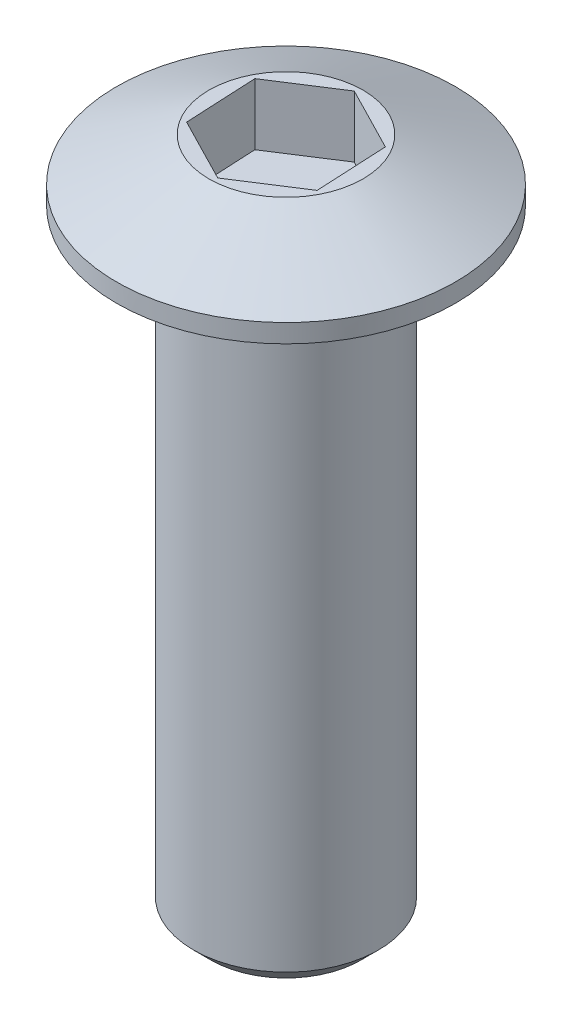
ISO-10303-21;
HEADER;
FILE_DESCRIPTION(('STEP AP214'),'2;1');
FILE_NAME('part.step','',(''),(''),'','','');
FILE_SCHEMA(('AUTOMOTIVE_DESIGN { 1 0 10303 214 1 1 1 1 }'));
ENDSEC;
DATA;
#1=APPLICATION_CONTEXT('core data for automotive mechanical design processes');
#2=APPLICATION_PROTOCOL_DEFINITION('international standard','automotive_design',2000,#1);
#3=PRODUCT_CONTEXT('',#1,'mechanical');
#4=PRODUCT('Part','Part','',(#3));
#5=PRODUCT_RELATED_PRODUCT_CATEGORY('part','',(#4));
#6=PRODUCT_DEFINITION_FORMATION('','',#4);
#7=PRODUCT_DEFINITION_CONTEXT('part definition',#1,'design');
#8=PRODUCT_DEFINITION('design','',#6,#7);
#9=PRODUCT_DEFINITION_SHAPE('','',#8);
#10=(LENGTH_UNIT() NAMED_UNIT(*) SI_UNIT(.MILLI.,.METRE.));
#11=(NAMED_UNIT(*) PLANE_ANGLE_UNIT() SI_UNIT($,.RADIAN.));
#12=(NAMED_UNIT(*) SI_UNIT($,.STERADIAN.) SOLID_ANGLE_UNIT());
#13=UNCERTAINTY_MEASURE_WITH_UNIT(LENGTH_MEASURE(1.E-05),#10,'distance_accuracy_value','');
#14=(GEOMETRIC_REPRESENTATION_CONTEXT(3) GLOBAL_UNCERTAINTY_ASSIGNED_CONTEXT((#13)) GLOBAL_UNIT_ASSIGNED_CONTEXT((#10,
#11,#12)) REPRESENTATION_CONTEXT('',''));
#15=CARTESIAN_POINT('',(0.,0.,0.));
#16=DIRECTION('',(0.,0.,1.));
#17=DIRECTION('',(1.,0.,0.));
#18=AXIS2_PLACEMENT_3D('',#15,#16,#17);
#19=CARTESIAN_POINT('',(0.,0.3,0.));
#20=DIRECTION('',(0.,-1.,0.));
#21=DIRECTION('',(0.,0.,-1.));
#22=AXIS2_PLACEMENT_3D('',#19,#20,#21);
#23=CYLINDRICAL_SURFACE('',#22,2.75);
#24=CARTESIAN_POINT('',(0.,0.3,0.));
#25=DIRECTION('',(0.,-1.,0.));
#26=DIRECTION('',(0.,0.,-1.));
#27=AXIS2_PLACEMENT_3D('',#24,#25,#26);
#28=CIRCLE('',#27,2.75);
#29=CARTESIAN_POINT('',(0.,0.3,-2.75));
#30=VERTEX_POINT('',#29);
#31=EDGE_CURVE('E12',#30,#30,#28,.F.);
#32=ORIENTED_EDGE('',*,*,#31,.F.);
#33=EDGE_LOOP('',(#32));
#34=FACE_BOUND('',#33,.T.);
#35=CARTESIAN_POINT('',(0.,0.,0.));
#36=DIRECTION('',(0.,1.,0.));
#37=DIRECTION('',(0.,0.,1.));
#38=AXIS2_PLACEMENT_3D('',#35,#36,#37);
#39=CIRCLE('',#38,2.75);
#40=CARTESIAN_POINT('',(0.,0.,2.75));
#41=VERTEX_POINT('',#40);
#42=EDGE_CURVE('E59',#41,#41,#39,.T.);
#43=ORIENTED_EDGE('',*,*,#42,.T.);
#44=EDGE_LOOP('',(#43));
#45=FACE_BOUND('',#44,.T.);
#46=ADVANCED_FACE('F51',(#34,#45),#23,.T.);
#47=CARTESIAN_POINT('',(0.,0.,0.));
#48=DIRECTION('',(0.,1.,0.));
#49=DIRECTION('',(0.,0.,1.));
#50=AXIS2_PLACEMENT_3D('',#47,#48,#49);
#51=PLANE('',#50);
#52=CARTESIAN_POINT('',(0.,0.,0.));
#53=DIRECTION('',(0.,1.,0.));
#54=DIRECTION('',(0.,0.,1.));
#55=AXIS2_PLACEMENT_3D('',#52,#53,#54);
#56=CIRCLE('',#55,1.5);
#57=CARTESIAN_POINT('',(0.,0.,1.5));
#58=VERTEX_POINT('',#57);
#59=EDGE_CURVE('E194',#58,#58,#56,.T.);
#60=ORIENTED_EDGE('',*,*,#59,.T.);
#61=EDGE_LOOP('',(#60));
#62=FACE_BOUND('',#61,.T.);
#63=ORIENTED_EDGE('',*,*,#42,.F.);
#64=EDGE_LOOP('',(#63));
#65=FACE_BOUND('',#64,.T.);
#66=ADVANCED_FACE('F181',(#62,#65),#51,.F.);
#67=CARTESIAN_POINT('',(0.,1.,0.));
#68=DIRECTION('',(0.,1.,0.));
#69=DIRECTION('',(0.,0.,1.));
#70=AXIS2_PLACEMENT_3D('',#67,#68,#69);
#71=PLANE('',#70);
#72=DIRECTION('',(0.889522607924794,0.,0.456891157706814));
#73=VECTOR('',#72,1.);
#74=CARTESIAN_POINT('',(-0.461832868428852,1.,0.899143637649117));
#75=LINE('',#74,#73);
#76=CARTESIAN_POINT('',(-0.980953689665708,1.,0.632504306741102));
#77=VERTEX_POINT('',#76);
#78=CARTESIAN_POINT('',(0.0572879528080049,1.,1.16578296855713));
#79=VERTEX_POINT('',#78);
#80=EDGE_CURVE('E66',#77,#79,#75,.T.);
#81=ORIENTED_EDGE('',*,*,#80,.F.);
#82=DIRECTION('',(0.0490819546238143,0.,0.998794754556864));
#83=VECTOR('',#82,1.);
#84=CARTESIAN_POINT('',(-1.00959766606971,1.,0.0496128224625365));
#85=LINE('',#84,#83);
#86=CARTESIAN_POINT('',(-1.03824164247371,1.,-0.533278661816029));
#87=VERTEX_POINT('',#86);
#88=EDGE_CURVE('E149',#87,#77,#85,.T.);
#89=ORIENTED_EDGE('',*,*,#88,.F.);
#90=DIRECTION('',(-0.84044065330098,0.,0.54190359685005));
#91=VECTOR('',#90,1.);
#92=CARTESIAN_POINT('',(-0.547764797640859,1.,-0.84953081518658));
#93=LINE('',#92,#91);
#94=CARTESIAN_POINT('',(-0.0572879528080048,1.,-1.16578296855713));
#95=VERTEX_POINT('',#94);
#96=EDGE_CURVE('E147',#95,#87,#93,.T.);
#97=ORIENTED_EDGE('',*,*,#96,.F.);
#98=DIRECTION('',(-0.889522607924794,0.,-0.456891157706814));
#99=VECTOR('',#98,1.);
#100=CARTESIAN_POINT('',(0.461832868428852,1.,-0.899143637649117));
#101=LINE('',#100,#99);
#102=CARTESIAN_POINT('',(0.980953689665708,1.,-0.632504306741103));
#103=VERTEX_POINT('',#102);
#104=EDGE_CURVE('E113',#103,#95,#101,.T.);
#105=ORIENTED_EDGE('',*,*,#104,.F.);
#106=DIRECTION('',(-0.0490819546238146,0.,-0.998794754556864));
#107=VECTOR('',#106,1.);
#108=CARTESIAN_POINT('',(1.00959766606971,1.,-0.0496128224625368));
#109=LINE('',#108,#107);
#110=CARTESIAN_POINT('',(1.03824164247371,1.,0.533278661816029));
#111=VERTEX_POINT('',#110);
#112=EDGE_CURVE('E143',#111,#103,#109,.T.);
#113=ORIENTED_EDGE('',*,*,#112,.F.);
#114=DIRECTION('',(0.84044065330098,0.,-0.54190359685005));
#115=VECTOR('',#114,1.);
#116=CARTESIAN_POINT('',(0.547764797640859,1.,0.84953081518658));
#117=LINE('',#116,#115);
#118=EDGE_CURVE('E139',#79,#111,#117,.T.);
#119=ORIENTED_EDGE('',*,*,#118,.F.);
#120=EDGE_LOOP('',(#81,#89,#97,#105,#113,#119));
#121=FACE_BOUND('',#120,.T.);
#122=CARTESIAN_POINT('',(0.,1.,0.));
#123=DIRECTION('',(0.,1.,0.));
#124=DIRECTION('',(0.,0.,1.));
#125=AXIS2_PLACEMENT_3D('',#122,#123,#124);
#126=CIRCLE('',#125,1.25);
#127=CARTESIAN_POINT('',(0.,1.,1.25));
#128=VERTEX_POINT('',#127);
#129=EDGE_CURVE('E153',#128,#128,#126,.T.);
#130=ORIENTED_EDGE('',*,*,#129,.T.);
#131=EDGE_LOOP('',(#130));
#132=FACE_BOUND('',#131,.T.);
#133=ADVANCED_FACE('F178',(#121,#132),#71,.T.);
#134=CARTESIAN_POINT('',(0.,1.,0.));
#135=DIRECTION('',(0.,-1.,0.));
#136=DIRECTION('',(0.,0.,-1.));
#137=AXIS2_PLACEMENT_3D('',#134,#135,#136);
#138=CONICAL_SURFACE('',#137,1.25,1.13416916698135);
#139=ORIENTED_EDGE('',*,*,#129,.F.);
#140=EDGE_LOOP('',(#139));
#141=FACE_BOUND('',#140,.T.);
#142=ORIENTED_EDGE('',*,*,#31,.T.);
#143=EDGE_LOOP('',(#142));
#144=FACE_BOUND('',#143,.T.);
#145=ADVANCED_FACE('F168',(#141,#144),#138,.T.);
#146=CARTESIAN_POINT('',(-0.461832868428852,0.,0.899143637649117));
#147=DIRECTION('',(-0.456891157706814,0.,0.889522607924794));
#148=DIRECTION('',(0.889522607924794,0.,0.456891157706814));
#149=AXIS2_PLACEMENT_3D('',#146,#147,#148);
#150=PLANE('',#149);
#151=ORIENTED_EDGE('',*,*,#80,.T.);
#152=DIRECTION('',(0.,1.,0.));
#153=VECTOR('',#152,1.);
#154=CARTESIAN_POINT('',(0.0572879528080049,0.,1.16578296855713));
#155=LINE('',#154,#153);
#156=CARTESIAN_POINT('',(0.0572879528080049,0.,1.16578296855713));
#157=VERTEX_POINT('',#156);
#158=EDGE_CURVE('E97',#157,#79,#155,.T.);
#159=ORIENTED_EDGE('',*,*,#158,.F.);
#160=DIRECTION('',(0.889522607924794,0.,0.456891157706814));
#161=VECTOR('',#160,1.);
#162=CARTESIAN_POINT('',(-0.461832868428852,0.,0.899143637649117));
#163=LINE('',#162,#161);
#164=CARTESIAN_POINT('',(-0.980953689665708,0.,0.632504306741102));
#165=VERTEX_POINT('',#164);
#166=EDGE_CURVE('E151',#165,#157,#163,.T.);
#167=ORIENTED_EDGE('',*,*,#166,.F.);
#168=DIRECTION('',(0.,1.,0.));
#169=VECTOR('',#168,1.);
#170=CARTESIAN_POINT('',(-0.980953689665708,0.,0.632504306741102));
#171=LINE('',#170,#169);
#172=EDGE_CURVE('E74',#165,#77,#171,.T.);
#173=ORIENTED_EDGE('',*,*,#172,.T.);
#174=EDGE_LOOP('',(#151,#159,#167,#173));
#175=FACE_BOUND('',#174,.T.);
#176=ADVANCED_FACE('F177',(#175),#150,.F.);
#177=CARTESIAN_POINT('',(-1.00959766606971,0.,0.0496128224625365));
#178=DIRECTION('',(-0.998794754556864,0.,0.0490819546238143));
#179=DIRECTION('',(0.0490819546238143,0.,0.998794754556864));
#180=AXIS2_PLACEMENT_3D('',#177,#178,#179);
#181=PLANE('',#180);
#182=ORIENTED_EDGE('',*,*,#88,.T.);
#183=ORIENTED_EDGE('',*,*,#172,.F.);
#184=DIRECTION('',(0.0490819546238143,0.,0.998794754556864));
#185=VECTOR('',#184,1.);
#186=CARTESIAN_POINT('',(-1.00959766606971,0.,0.0496128224625365));
#187=LINE('',#186,#185);
#188=CARTESIAN_POINT('',(-1.03824164247371,0.,-0.533278661816029));
#189=VERTEX_POINT('',#188);
#190=EDGE_CURVE('E125',#189,#165,#187,.T.);
#191=ORIENTED_EDGE('',*,*,#190,.F.);
#192=DIRECTION('',(0.,1.,0.));
#193=VECTOR('',#192,1.);
#194=CARTESIAN_POINT('',(-1.03824164247371,0.,-0.533278661816029));
#195=LINE('',#194,#193);
#196=EDGE_CURVE('E117',#189,#87,#195,.T.);
#197=ORIENTED_EDGE('',*,*,#196,.T.);
#198=EDGE_LOOP('',(#182,#183,#191,#197));
#199=FACE_BOUND('',#198,.T.);
#200=ADVANCED_FACE('F226',(#199),#181,.F.);
#201=CARTESIAN_POINT('',(-0.547764797640859,0.,-0.84953081518658));
#202=DIRECTION('',(-0.54190359685005,0.,-0.84044065330098));
#203=DIRECTION('',(-0.84044065330098,0.,0.54190359685005));
#204=AXIS2_PLACEMENT_3D('',#201,#202,#203);
#205=PLANE('',#204);
#206=ORIENTED_EDGE('',*,*,#96,.T.);
#207=ORIENTED_EDGE('',*,*,#196,.F.);
#208=DIRECTION('',(-0.84044065330098,0.,0.54190359685005));
#209=VECTOR('',#208,1.);
#210=CARTESIAN_POINT('',(-0.547764797640859,0.,-0.84953081518658));
#211=LINE('',#210,#209);
#212=CARTESIAN_POINT('',(-0.0572879528080048,0.,-1.16578296855713));
#213=VERTEX_POINT('',#212);
#214=EDGE_CURVE('E121',#213,#189,#211,.T.);
#215=ORIENTED_EDGE('',*,*,#214,.F.);
#216=DIRECTION('',(0.,1.,0.));
#217=VECTOR('',#216,1.);
#218=CARTESIAN_POINT('',(-0.0572879528080048,0.,-1.16578296855713));
#219=LINE('',#218,#217);
#220=EDGE_CURVE('E106',#213,#95,#219,.T.);
#221=ORIENTED_EDGE('',*,*,#220,.T.);
#222=EDGE_LOOP('',(#206,#207,#215,#221));
#223=FACE_BOUND('',#222,.T.);
#224=ADVANCED_FACE('F122',(#223),#205,.F.);
#225=CARTESIAN_POINT('',(0.461832868428852,0.,-0.899143637649117));
#226=DIRECTION('',(0.456891157706814,0.,-0.889522607924794));
#227=DIRECTION('',(-0.889522607924794,0.,-0.456891157706814));
#228=AXIS2_PLACEMENT_3D('',#225,#226,#227);
#229=PLANE('',#228);
#230=ORIENTED_EDGE('',*,*,#104,.T.);
#231=ORIENTED_EDGE('',*,*,#220,.F.);
#232=DIRECTION('',(-0.889522607924794,0.,-0.456891157706814));
#233=VECTOR('',#232,1.);
#234=CARTESIAN_POINT('',(0.461832868428852,0.,-0.899143637649117));
#235=LINE('',#234,#233);
#236=CARTESIAN_POINT('',(0.980953689665708,0.,-0.632504306741103));
#237=VERTEX_POINT('',#236);
#238=EDGE_CURVE('E110',#237,#213,#235,.T.);
#239=ORIENTED_EDGE('',*,*,#238,.F.);
#240=DIRECTION('',(0.,1.,0.));
#241=VECTOR('',#240,1.);
#242=CARTESIAN_POINT('',(0.980953689665708,0.,-0.632504306741103));
#243=LINE('',#242,#241);
#244=EDGE_CURVE('E118',#237,#103,#243,.T.);
#245=ORIENTED_EDGE('',*,*,#244,.T.);
#246=EDGE_LOOP('',(#230,#231,#239,#245));
#247=FACE_BOUND('',#246,.T.);
#248=ADVANCED_FACE('F108',(#247),#229,.F.);
#249=CARTESIAN_POINT('',(1.00959766606971,0.,-0.0496128224625368));
#250=DIRECTION('',(0.998794754556864,0.,-0.0490819546238146));
#251=DIRECTION('',(-0.0490819546238146,0.,-0.998794754556864));
#252=AXIS2_PLACEMENT_3D('',#249,#250,#251);
#253=PLANE('',#252);
#254=ORIENTED_EDGE('',*,*,#112,.T.);
#255=ORIENTED_EDGE('',*,*,#244,.F.);
#256=DIRECTION('',(-0.0490819546238146,0.,-0.998794754556864));
#257=VECTOR('',#256,1.);
#258=CARTESIAN_POINT('',(1.00959766606971,0.,-0.0496128224625368));
#259=LINE('',#258,#257);
#260=CARTESIAN_POINT('',(1.03824164247371,0.,0.533278661816029));
#261=VERTEX_POINT('',#260);
#262=EDGE_CURVE('E131',#261,#237,#259,.T.);
#263=ORIENTED_EDGE('',*,*,#262,.F.);
#264=DIRECTION('',(0.,1.,0.));
#265=VECTOR('',#264,1.);
#266=CARTESIAN_POINT('',(1.03824164247371,0.,0.533278661816029));
#267=LINE('',#266,#265);
#268=EDGE_CURVE('E156',#261,#111,#267,.T.);
#269=ORIENTED_EDGE('',*,*,#268,.T.);
#270=EDGE_LOOP('',(#254,#255,#263,#269));
#271=FACE_BOUND('',#270,.T.);
#272=ADVANCED_FACE('F224',(#271),#253,.F.);
#273=CARTESIAN_POINT('',(0.547764797640859,0.,0.84953081518658));
#274=DIRECTION('',(0.54190359685005,0.,0.84044065330098));
#275=DIRECTION('',(0.84044065330098,0.,-0.54190359685005));
#276=AXIS2_PLACEMENT_3D('',#273,#274,#275);
#277=PLANE('',#276);
#278=ORIENTED_EDGE('',*,*,#118,.T.);
#279=ORIENTED_EDGE('',*,*,#268,.F.);
#280=DIRECTION('',(0.84044065330098,0.,-0.54190359685005));
#281=VECTOR('',#280,1.);
#282=CARTESIAN_POINT('',(0.547764797640859,0.,0.84953081518658));
#283=LINE('',#282,#281);
#284=EDGE_CURVE('E133',#157,#261,#283,.T.);
#285=ORIENTED_EDGE('',*,*,#284,.F.);
#286=ORIENTED_EDGE('',*,*,#158,.T.);
#287=EDGE_LOOP('',(#278,#279,#285,#286));
#288=FACE_BOUND('',#287,.T.);
#289=ADVANCED_FACE('F220',(#288),#277,.F.);
#290=CARTESIAN_POINT('',(1.5,0.,0.));
#291=DIRECTION('',(0.,1.,0.));
#292=DIRECTION('',(0.,0.,1.));
#293=AXIS2_PLACEMENT_3D('',#290,#291,#292);
#294=PLANE('',#293);
#295=ORIENTED_EDGE('',*,*,#166,.T.);
#296=ORIENTED_EDGE('',*,*,#284,.T.);
#297=ORIENTED_EDGE('',*,*,#262,.T.);
#298=ORIENTED_EDGE('',*,*,#238,.T.);
#299=ORIENTED_EDGE('',*,*,#214,.T.);
#300=ORIENTED_EDGE('',*,*,#190,.T.);
#301=EDGE_LOOP('',(#295,#296,#297,#298,#299,#300));
#302=FACE_BOUND('',#301,.T.);
#303=ADVANCED_FACE('F128',(#302),#294,.T.);
#304=CARTESIAN_POINT('',(1.2195,-10.,0.));
#305=DIRECTION('',(0.,-1.,0.));
#306=DIRECTION('',(0.,0.,-1.));
#307=AXIS2_PLACEMENT_3D('',#304,#305,#306);
#308=PLANE('',#307);
#309=CARTESIAN_POINT('',(0.,-10.,0.));
#310=DIRECTION('',(0.,1.,0.));
#311=DIRECTION('',(0.,0.,1.));
#312=AXIS2_PLACEMENT_3D('',#309,#310,#311);
#313=CIRCLE('',#312,1.2195);
#314=CARTESIAN_POINT('',(0.,-10.,1.2195));
#315=VERTEX_POINT('',#314);
#316=EDGE_CURVE('E140',#315,#315,#313,.T.);
#317=ORIENTED_EDGE('',*,*,#316,.F.);
#318=EDGE_LOOP('',(#317));
#319=FACE_BOUND('',#318,.T.);
#320=ADVANCED_FACE('F244',(#319),#308,.T.);
#321=CARTESIAN_POINT('',(0.,-9.71950000000001,0.));
#322=DIRECTION('',(0.,1.,0.));
#323=DIRECTION('',(0.,0.,1.));
#324=AXIS2_PLACEMENT_3D('',#321,#322,#323);
#325=CONICAL_SURFACE('',#324,1.5,0.785398163397453);
#326=ORIENTED_EDGE('',*,*,#316,.T.);
#327=EDGE_LOOP('',(#326));
#328=FACE_BOUND('',#327,.T.);
#329=CARTESIAN_POINT('',(0.,-9.71950000000001,0.));
#330=DIRECTION('',(0.,1.,0.));
#331=DIRECTION('',(0.,0.,1.));
#332=AXIS2_PLACEMENT_3D('',#329,#330,#331);
#333=CIRCLE('',#332,1.5);
#334=CARTESIAN_POINT('',(0.,-9.71950000000001,1.5));
#335=VERTEX_POINT('',#334);
#336=EDGE_CURVE('E211',#335,#335,#333,.T.);
#337=ORIENTED_EDGE('',*,*,#336,.F.);
#338=EDGE_LOOP('',(#337));
#339=FACE_BOUND('',#338,.T.);
#340=ADVANCED_FACE('F249',(#328,#339),#325,.T.);
#341=CARTESIAN_POINT('',(0.,0.,0.));
#342=DIRECTION('',(0.,1.,0.));
#343=DIRECTION('',(0.,0.,1.));
#344=AXIS2_PLACEMENT_3D('',#341,#342,#343);
#345=CYLINDRICAL_SURFACE('',#344,1.5);
#346=ORIENTED_EDGE('',*,*,#336,.T.);
#347=EDGE_LOOP('',(#346));
#348=FACE_BOUND('',#347,.T.);
#349=ORIENTED_EDGE('',*,*,#59,.F.);
#350=EDGE_LOOP('',(#349));
#351=FACE_BOUND('',#350,.T.);
#352=ADVANCED_FACE('F254',(#348,#351),#345,.T.);
#353=CLOSED_SHELL('',(#46,#66,#133,#145,#176,#200,#224,#248,#272,#289,#303,#320,#340,#352));
#354=MANIFOLD_SOLID_BREP('B2',#353);
#355=ADVANCED_BREP_SHAPE_REPRESENTATION('',(#18,#354),#14);
#356=SHAPE_DEFINITION_REPRESENTATION(#9,#355);
ENDSEC;
END-ISO-10303-21;
